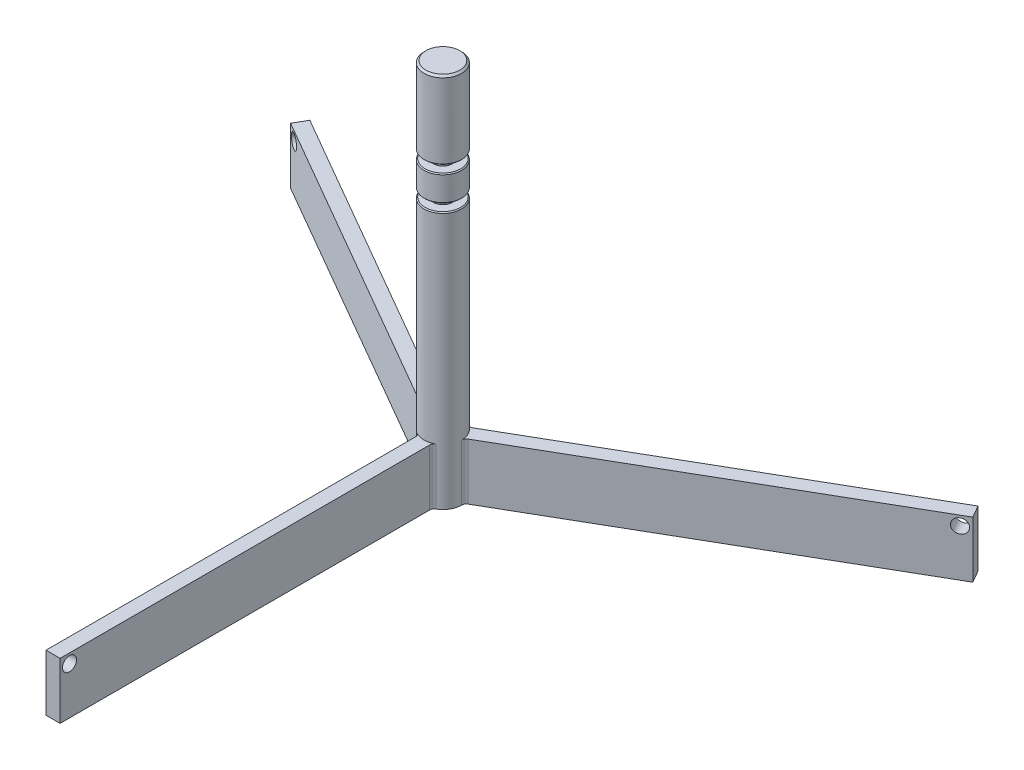
ISO-10303-21;
HEADER;
FILE_DESCRIPTION(('STEP AP214'),'2;1');
FILE_NAME('part.step','',(''),(''),'','','');
FILE_SCHEMA(('AUTOMOTIVE_DESIGN { 1 0 10303 214 1 1 1 1 }'));
ENDSEC;
DATA;
#1=APPLICATION_CONTEXT('core data for automotive mechanical design processes');
#2=APPLICATION_PROTOCOL_DEFINITION('international standard','automotive_design',2000,#1);
#3=PRODUCT_CONTEXT('',#1,'mechanical');
#4=PRODUCT('Part','Part','',(#3));
#5=PRODUCT_RELATED_PRODUCT_CATEGORY('part','',(#4));
#6=PRODUCT_DEFINITION_FORMATION('','',#4);
#7=PRODUCT_DEFINITION_CONTEXT('part definition',#1,'design');
#8=PRODUCT_DEFINITION('design','',#6,#7);
#9=PRODUCT_DEFINITION_SHAPE('','',#8);
#10=(LENGTH_UNIT() NAMED_UNIT(*) SI_UNIT(.MILLI.,.METRE.));
#11=(NAMED_UNIT(*) PLANE_ANGLE_UNIT() SI_UNIT($,.RADIAN.));
#12=(NAMED_UNIT(*) SI_UNIT($,.STERADIAN.) SOLID_ANGLE_UNIT());
#13=UNCERTAINTY_MEASURE_WITH_UNIT(LENGTH_MEASURE(1.E-05),#10,'distance_accuracy_value','');
#14=(GEOMETRIC_REPRESENTATION_CONTEXT(3) GLOBAL_UNCERTAINTY_ASSIGNED_CONTEXT((#13)) GLOBAL_UNIT_ASSIGNED_CONTEXT((#10,
#11,#12)) REPRESENTATION_CONTEXT('',''));
#15=CARTESIAN_POINT('',(0.,0.,0.));
#16=DIRECTION('',(0.,0.,1.));
#17=DIRECTION('',(1.,0.,0.));
#18=AXIS2_PLACEMENT_3D('',#15,#16,#17);
#19=CARTESIAN_POINT('',(0.,112.38552238806,0.));
#20=DIRECTION('',(0.,1.,0.));
#21=DIRECTION('',(0.,0.,1.));
#22=AXIS2_PLACEMENT_3D('',#19,#20,#21);
#23=CYLINDRICAL_SURFACE('',#22,12.7);
#24=CARTESIAN_POINT('',(0.,173.355,0.));
#25=DIRECTION('',(0.,-1.,0.));
#26=DIRECTION('',(0.,0.,-1.));
#27=AXIS2_PLACEMENT_3D('',#24,#25,#26);
#28=CIRCLE('',#27,12.7);
#29=CARTESIAN_POINT('',(0.,173.355,-12.7));
#30=VERTEX_POINT('',#29);
#31=EDGE_CURVE('E318',#30,#30,#28,.T.);
#32=ORIENTED_EDGE('',*,*,#31,.T.);
#33=EDGE_LOOP('',(#32));
#34=FACE_BOUND('',#33,.T.);
#35=CARTESIAN_POINT('',(0.,38.1,0.));
#36=DIRECTION('',(0.,-1.,0.));
#37=DIRECTION('',(0.,0.,-1.));
#38=AXIS2_PLACEMENT_3D('',#35,#36,#37);
#39=CIRCLE('',#38,12.7);
#40=CARTESIAN_POINT('',(6.35000000000009,38.1,-10.9985226280623));
#41=VERTEX_POINT('',#40);
#42=CARTESIAN_POINT('',(12.7,38.1,1.17961196366423E-13));
#43=VERTEX_POINT('',#42);
#44=EDGE_CURVE('E275',#41,#43,#39,.T.);
#45=ORIENTED_EDGE('',*,*,#44,.F.);
#46=DIRECTION('',(0.,1.,0.));
#47=VECTOR('',#46,1.);
#48=CARTESIAN_POINT('',(6.35000000000009,112.38552238806,-10.9985226280623));
#49=LINE('',#48,#47);
#50=CARTESIAN_POINT('',(6.35000000000009,0.,-10.9985226280623));
#51=VERTEX_POINT('',#50);
#52=EDGE_CURVE('E305',#41,#51,#49,.F.);
#53=ORIENTED_EDGE('',*,*,#52,.T.);
#54=CARTESIAN_POINT('',(0.,0.,0.));
#55=DIRECTION('',(0.,1.,0.));
#56=DIRECTION('',(0.,0.,1.));
#57=AXIS2_PLACEMENT_3D('',#54,#55,#56);
#58=CIRCLE('',#57,12.7);
#59=CARTESIAN_POINT('',(-6.34999999999994,0.,-10.9985226280624));
#60=VERTEX_POINT('',#59);
#61=EDGE_CURVE('E240',#51,#60,#58,.T.);
#62=ORIENTED_EDGE('',*,*,#61,.T.);
#63=DIRECTION('',(0.,1.,0.));
#64=VECTOR('',#63,1.);
#65=CARTESIAN_POINT('',(-6.34999999999994,112.38552238806,-10.9985226280624));
#66=LINE('',#65,#64);
#67=CARTESIAN_POINT('',(-6.34999999999994,38.1,-10.9985226280624));
#68=VERTEX_POINT('',#67);
#69=EDGE_CURVE('E281',#60,#68,#66,.T.);
#70=ORIENTED_EDGE('',*,*,#69,.T.);
#71=CARTESIAN_POINT('',(-12.7,38.1,0.));
#72=VERTEX_POINT('',#71);
#73=EDGE_CURVE('E277',#72,#68,#39,.T.);
#74=ORIENTED_EDGE('',*,*,#73,.F.);
#75=DIRECTION('',(0.,1.,0.));
#76=VECTOR('',#75,1.);
#77=CARTESIAN_POINT('',(-12.7,112.38552238806,0.));
#78=LINE('',#77,#76);
#79=CARTESIAN_POINT('',(-12.7,0.,0.));
#80=VERTEX_POINT('',#79);
#81=EDGE_CURVE('E284',#72,#80,#78,.F.);
#82=ORIENTED_EDGE('',*,*,#81,.T.);
#83=CARTESIAN_POINT('',(-6.35,0.,10.9985226280624));
#84=VERTEX_POINT('',#83);
#85=EDGE_CURVE('E235',#80,#84,#58,.T.);
#86=ORIENTED_EDGE('',*,*,#85,.T.);
#87=DIRECTION('',(0.,1.,0.));
#88=VECTOR('',#87,1.);
#89=CARTESIAN_POINT('',(-6.35,112.38552238806,10.9985226280624));
#90=LINE('',#89,#88);
#91=CARTESIAN_POINT('',(-6.35,38.1,10.9985226280624));
#92=VERTEX_POINT('',#91);
#93=EDGE_CURVE('E257',#84,#92,#90,.T.);
#94=ORIENTED_EDGE('',*,*,#93,.T.);
#95=CARTESIAN_POINT('',(0.,38.1,0.));
#96=DIRECTION('',(0.,-1.,0.));
#97=DIRECTION('',(0.,0.,-1.));
#98=AXIS2_PLACEMENT_3D('',#95,#96,#97);
#99=CIRCLE('',#98,12.7);
#100=CARTESIAN_POINT('',(6.35,38.1,10.9985226280624));
#101=VERTEX_POINT('',#100);
#102=EDGE_CURVE('E252',#101,#92,#99,.T.);
#103=ORIENTED_EDGE('',*,*,#102,.F.);
#104=DIRECTION('',(0.,1.,0.));
#105=VECTOR('',#104,1.);
#106=CARTESIAN_POINT('',(6.35,112.38552238806,10.9985226280624));
#107=LINE('',#106,#105);
#108=CARTESIAN_POINT('',(6.35,0.,10.9985226280624));
#109=VERTEX_POINT('',#108);
#110=EDGE_CURVE('E260',#101,#109,#107,.F.);
#111=ORIENTED_EDGE('',*,*,#110,.T.);
#112=CARTESIAN_POINT('',(12.7,0.,1.17961196366423E-13));
#113=VERTEX_POINT('',#112);
#114=EDGE_CURVE('E236',#109,#113,#58,.T.);
#115=ORIENTED_EDGE('',*,*,#114,.T.);
#116=DIRECTION('',(0.,1.,0.));
#117=VECTOR('',#116,1.);
#118=CARTESIAN_POINT('',(12.7,112.38552238806,1.17961196366423E-13));
#119=LINE('',#118,#117);
#120=EDGE_CURVE('E302',#113,#43,#119,.T.);
#121=ORIENTED_EDGE('',*,*,#120,.T.);
#122=EDGE_LOOP('',(#45,#53,#62,#70,#74,#82,#86,#94,#103,#111,#115,#121));
#123=FACE_BOUND('',#122,.T.);
#124=ADVANCED_FACE('F33',(#34,#123),#23,.T.);
#125=CARTESIAN_POINT('',(0.,254.,0.));
#126=DIRECTION('',(0.,-1.,0.));
#127=DIRECTION('',(0.,0.,-1.));
#128=AXIS2_PLACEMENT_3D('',#125,#126,#127);
#129=PLANE('',#128);
#130=CARTESIAN_POINT('',(0.,254.,0.));
#131=DIRECTION('',(0.,-1.,0.));
#132=DIRECTION('',(0.,0.,-1.));
#133=AXIS2_PLACEMENT_3D('',#130,#131,#132);
#134=CIRCLE('',#133,11.43);
#135=CARTESIAN_POINT('',(0.,254.,-11.43));
#136=VERTEX_POINT('',#135);
#137=EDGE_CURVE('E41',#136,#136,#134,.F.);
#138=ORIENTED_EDGE('',*,*,#137,.T.);
#139=EDGE_LOOP('',(#138));
#140=FACE_BOUND('',#139,.T.);
#141=ADVANCED_FACE('F341',(#140),#129,.F.);
#142=CARTESIAN_POINT('',(0.,112.38552238806,0.));
#143=DIRECTION('',(0.,1.,0.));
#144=DIRECTION('',(0.,0.,1.));
#145=AXIS2_PLACEMENT_3D('',#142,#143,#144);
#146=CYLINDRICAL_SURFACE('',#145,12.7);
#147=CARTESIAN_POINT('',(0.,252.73,0.));
#148=DIRECTION('',(0.,-1.,0.));
#149=DIRECTION('',(0.,0.,-1.));
#150=AXIS2_PLACEMENT_3D('',#147,#148,#149);
#151=CIRCLE('',#150,12.7);
#152=CARTESIAN_POINT('',(0.,252.73,-12.7));
#153=VERTEX_POINT('',#152);
#154=EDGE_CURVE('E11',#153,#153,#151,.T.);
#155=ORIENTED_EDGE('',*,*,#154,.T.);
#156=EDGE_LOOP('',(#155));
#157=FACE_BOUND('',#156,.T.);
#158=CARTESIAN_POINT('',(0.,202.311,0.));
#159=DIRECTION('',(0.,1.,0.));
#160=DIRECTION('',(0.,0.,1.));
#161=AXIS2_PLACEMENT_3D('',#158,#159,#160);
#162=CIRCLE('',#161,12.7);
#163=CARTESIAN_POINT('',(0.,202.311,12.7));
#164=VERTEX_POINT('',#163);
#165=EDGE_CURVE('E333',#164,#164,#162,.T.);
#166=ORIENTED_EDGE('',*,*,#165,.T.);
#167=EDGE_LOOP('',(#166));
#168=FACE_BOUND('',#167,.T.);
#169=ADVANCED_FACE('F358',(#157,#168),#146,.T.);
#170=CARTESIAN_POINT('',(6.35,201.676,0.));
#171=DIRECTION('',(0.,1.,0.));
#172=DIRECTION('',(0.,0.,1.));
#173=AXIS2_PLACEMENT_3D('',#170,#171,#172);
#174=PLANE('',#173);
#175=CARTESIAN_POINT('',(0.,201.676,0.));
#176=DIRECTION('',(0.,1.,0.));
#177=DIRECTION('',(0.,0.,1.));
#178=AXIS2_PLACEMENT_3D('',#175,#176,#177);
#179=CIRCLE('',#178,12.065);
#180=CARTESIAN_POINT('',(0.,201.676,12.065));
#181=VERTEX_POINT('',#180);
#182=EDGE_CURVE('E336',#181,#181,#179,.F.);
#183=ORIENTED_EDGE('',*,*,#182,.T.);
#184=EDGE_LOOP('',(#183));
#185=FACE_BOUND('',#184,.T.);
#186=CARTESIAN_POINT('',(0.,201.676,0.));
#187=DIRECTION('',(0.,1.,0.));
#188=DIRECTION('',(0.,0.,1.));
#189=AXIS2_PLACEMENT_3D('',#186,#187,#188);
#190=CIRCLE('',#189,6.35);
#191=CARTESIAN_POINT('',(0.,201.676,6.35));
#192=VERTEX_POINT('',#191);
#193=EDGE_CURVE('E249',#192,#192,#190,.T.);
#194=ORIENTED_EDGE('',*,*,#193,.T.);
#195=EDGE_LOOP('',(#194));
#196=FACE_BOUND('',#195,.T.);
#197=ADVANCED_FACE('F387',(#185,#196),#174,.F.);
#198=CARTESIAN_POINT('',(0.,112.38552238806,0.));
#199=DIRECTION('',(0.,1.,0.));
#200=DIRECTION('',(0.,0.,1.));
#201=AXIS2_PLACEMENT_3D('',#198,#199,#200);
#202=CYLINDRICAL_SURFACE('',#201,6.35);
#203=ORIENTED_EDGE('',*,*,#193,.F.);
#204=EDGE_LOOP('',(#203));
#205=FACE_BOUND('',#204,.T.);
#206=CARTESIAN_POINT('',(0.,196.596,0.));
#207=DIRECTION('',(0.,1.,0.));
#208=DIRECTION('',(0.,0.,1.));
#209=AXIS2_PLACEMENT_3D('',#206,#207,#208);
#210=CIRCLE('',#209,6.35);
#211=CARTESIAN_POINT('',(0.,196.596,6.35));
#212=VERTEX_POINT('',#211);
#213=EDGE_CURVE('E246',#212,#212,#210,.T.);
#214=ORIENTED_EDGE('',*,*,#213,.T.);
#215=EDGE_LOOP('',(#214));
#216=FACE_BOUND('',#215,.T.);
#217=ADVANCED_FACE('F383',(#205,#216),#202,.T.);
#218=CARTESIAN_POINT('',(12.7,196.596,0.));
#219=DIRECTION('',(0.,-1.,0.));
#220=DIRECTION('',(0.,0.,-1.));
#221=AXIS2_PLACEMENT_3D('',#218,#219,#220);
#222=PLANE('',#221);
#223=CARTESIAN_POINT('',(0.,196.596,0.));
#224=DIRECTION('',(0.,-1.,0.));
#225=DIRECTION('',(0.,0.,-1.));
#226=AXIS2_PLACEMENT_3D('',#223,#224,#225);
#227=CIRCLE('',#226,12.065);
#228=CARTESIAN_POINT('',(0.,196.596,-12.065));
#229=VERTEX_POINT('',#228);
#230=EDGE_CURVE('E330',#229,#229,#227,.F.);
#231=ORIENTED_EDGE('',*,*,#230,.T.);
#232=EDGE_LOOP('',(#231));
#233=FACE_BOUND('',#232,.T.);
#234=ORIENTED_EDGE('',*,*,#213,.F.);
#235=EDGE_LOOP('',(#234));
#236=FACE_BOUND('',#235,.T.);
#237=ADVANCED_FACE('F379',(#233,#236),#222,.F.);
#238=CARTESIAN_POINT('',(0.,112.38552238806,0.));
#239=DIRECTION('',(0.,1.,0.));
#240=DIRECTION('',(0.,0.,1.));
#241=AXIS2_PLACEMENT_3D('',#238,#239,#240);
#242=CYLINDRICAL_SURFACE('',#241,12.7);
#243=CARTESIAN_POINT('',(0.,179.705,0.));
#244=DIRECTION('',(0.,1.,0.));
#245=DIRECTION('',(0.,0.,1.));
#246=AXIS2_PLACEMENT_3D('',#243,#244,#245);
#247=CIRCLE('',#246,12.7);
#248=CARTESIAN_POINT('',(0.,179.705,12.7));
#249=VERTEX_POINT('',#248);
#250=EDGE_CURVE('E324',#249,#249,#247,.T.);
#251=ORIENTED_EDGE('',*,*,#250,.T.);
#252=EDGE_LOOP('',(#251));
#253=FACE_BOUND('',#252,.T.);
#254=CARTESIAN_POINT('',(0.,195.961,0.));
#255=DIRECTION('',(0.,-1.,0.));
#256=DIRECTION('',(0.,0.,-1.));
#257=AXIS2_PLACEMENT_3D('',#254,#255,#256);
#258=CIRCLE('',#257,12.7);
#259=CARTESIAN_POINT('',(0.,195.961,-12.7));
#260=VERTEX_POINT('',#259);
#261=EDGE_CURVE('E321',#260,#260,#258,.T.);
#262=ORIENTED_EDGE('',*,*,#261,.T.);
#263=EDGE_LOOP('',(#262));
#264=FACE_BOUND('',#263,.T.);
#265=ADVANCED_FACE('F375',(#253,#264),#242,.T.);
#266=CARTESIAN_POINT('',(6.35,179.07,0.));
#267=DIRECTION('',(0.,1.,0.));
#268=DIRECTION('',(0.,0.,1.));
#269=AXIS2_PLACEMENT_3D('',#266,#267,#268);
#270=PLANE('',#269);
#271=CARTESIAN_POINT('',(0.,179.07,0.));
#272=DIRECTION('',(0.,1.,0.));
#273=DIRECTION('',(0.,0.,1.));
#274=AXIS2_PLACEMENT_3D('',#271,#272,#273);
#275=CIRCLE('',#274,12.065);
#276=CARTESIAN_POINT('',(0.,179.07,12.065));
#277=VERTEX_POINT('',#276);
#278=EDGE_CURVE('E327',#277,#277,#275,.F.);
#279=ORIENTED_EDGE('',*,*,#278,.T.);
#280=EDGE_LOOP('',(#279));
#281=FACE_BOUND('',#280,.T.);
#282=CARTESIAN_POINT('',(0.,179.07,0.));
#283=DIRECTION('',(0.,1.,0.));
#284=DIRECTION('',(0.,0.,1.));
#285=AXIS2_PLACEMENT_3D('',#282,#283,#284);
#286=CIRCLE('',#285,6.35);
#287=CARTESIAN_POINT('',(0.,179.07,6.35));
#288=VERTEX_POINT('',#287);
#289=EDGE_CURVE('E243',#288,#288,#286,.T.);
#290=ORIENTED_EDGE('',*,*,#289,.T.);
#291=EDGE_LOOP('',(#290));
#292=FACE_BOUND('',#291,.T.);
#293=ADVANCED_FACE('F371',(#281,#292),#270,.F.);
#294=CARTESIAN_POINT('',(0.,112.38552238806,0.));
#295=DIRECTION('',(0.,1.,0.));
#296=DIRECTION('',(0.,0.,1.));
#297=AXIS2_PLACEMENT_3D('',#294,#295,#296);
#298=CYLINDRICAL_SURFACE('',#297,6.35);
#299=ORIENTED_EDGE('',*,*,#289,.F.);
#300=EDGE_LOOP('',(#299));
#301=FACE_BOUND('',#300,.T.);
#302=CARTESIAN_POINT('',(0.,173.99,0.));
#303=DIRECTION('',(0.,1.,0.));
#304=DIRECTION('',(0.,0.,1.));
#305=AXIS2_PLACEMENT_3D('',#302,#303,#304);
#306=CIRCLE('',#305,6.35);
#307=CARTESIAN_POINT('',(0.,173.99,6.35));
#308=VERTEX_POINT('',#307);
#309=EDGE_CURVE('E239',#308,#308,#306,.T.);
#310=ORIENTED_EDGE('',*,*,#309,.T.);
#311=EDGE_LOOP('',(#310));
#312=FACE_BOUND('',#311,.T.);
#313=ADVANCED_FACE('F367',(#301,#312),#298,.T.);
#314=CARTESIAN_POINT('',(12.7,173.99,0.));
#315=DIRECTION('',(0.,-1.,0.));
#316=DIRECTION('',(0.,0.,-1.));
#317=AXIS2_PLACEMENT_3D('',#314,#315,#316);
#318=PLANE('',#317);
#319=CARTESIAN_POINT('',(0.,173.99,0.));
#320=DIRECTION('',(0.,-1.,0.));
#321=DIRECTION('',(0.,0.,-1.));
#322=AXIS2_PLACEMENT_3D('',#319,#320,#321);
#323=CIRCLE('',#322,12.065);
#324=CARTESIAN_POINT('',(0.,173.99,-12.065));
#325=VERTEX_POINT('',#324);
#326=EDGE_CURVE('E315',#325,#325,#323,.F.);
#327=ORIENTED_EDGE('',*,*,#326,.T.);
#328=EDGE_LOOP('',(#327));
#329=FACE_BOUND('',#328,.T.);
#330=ORIENTED_EDGE('',*,*,#309,.F.);
#331=EDGE_LOOP('',(#330));
#332=FACE_BOUND('',#331,.T.);
#333=ADVANCED_FACE('F364',(#329,#332),#318,.F.);
#334=CARTESIAN_POINT('',(0.,0.,0.));
#335=DIRECTION('',(0.,1.,0.));
#336=DIRECTION('',(0.,0.,1.));
#337=AXIS2_PLACEMENT_3D('',#334,#335,#336);
#338=PLANE('',#337);
#339=ORIENTED_EDGE('',*,*,#85,.F.);
#340=CARTESIAN_POINT('',(-15.875,0.,0.));
#341=DIRECTION('',(0.,1.,0.));
#342=DIRECTION('',(0.,0.,1.));
#343=AXIS2_PLACEMENT_3D('',#340,#341,#342);
#344=CIRCLE('',#343,3.175);
#345=CARTESIAN_POINT('',(-14.2875,0.,-2.74963065701563));
#346=VERTEX_POINT('',#345);
#347=EDGE_CURVE('E292',#80,#346,#344,.T.);
#348=ORIENTED_EDGE('',*,*,#347,.T.);
#349=DIRECTION('',(0.866025403784436,0.,0.500000000000004));
#350=VECTOR('',#349,1.);
#351=CARTESIAN_POINT('',(-230.600594532294,0.,-127.638054014478));
#352=LINE('',#351,#350);
#353=CARTESIAN_POINT('',(-230.600594532294,0.,-127.638054014478));
#354=VERTEX_POINT('',#353);
#355=EDGE_CURVE('E202',#354,#346,#352,.T.);
#356=ORIENTED_EDGE('',*,*,#355,.F.);
#357=DIRECTION('',(-0.500000000000004,0.,0.866025403784436));
#358=VECTOR('',#357,1.);
#359=CARTESIAN_POINT('',(-225.838094532294,0.,-135.886945985524));
#360=LINE('',#359,#358);
#361=CARTESIAN_POINT('',(-225.838094532294,0.,-135.886945985524));
#362=VERTEX_POINT('',#361);
#363=EDGE_CURVE('E185',#362,#354,#360,.T.);
#364=ORIENTED_EDGE('',*,*,#363,.F.);
#365=DIRECTION('',(0.866025403784436,0.,0.500000000000004));
#366=VECTOR('',#365,1.);
#367=CARTESIAN_POINT('',(-225.838094532294,0.,-135.886945985524));
#368=LINE('',#367,#366);
#369=CARTESIAN_POINT('',(-9.5249999999999,0.,-10.9985226280624));
#370=VERTEX_POINT('',#369);
#371=EDGE_CURVE('E205',#362,#370,#368,.T.);
#372=ORIENTED_EDGE('',*,*,#371,.T.);
#373=CARTESIAN_POINT('',(-7.93749999999992,0.,-13.748153285078));
#374=DIRECTION('',(0.,1.,0.));
#375=DIRECTION('',(0.,0.,1.));
#376=AXIS2_PLACEMENT_3D('',#373,#374,#375);
#377=CIRCLE('',#376,3.175);
#378=EDGE_CURVE('E294',#370,#60,#377,.T.);
#379=ORIENTED_EDGE('',*,*,#378,.T.);
#380=ORIENTED_EDGE('',*,*,#61,.F.);
#381=CARTESIAN_POINT('',(7.93750000000011,0.,-13.7481532850779));
#382=DIRECTION('',(0.,1.,0.));
#383=DIRECTION('',(0.,0.,1.));
#384=AXIS2_PLACEMENT_3D('',#381,#382,#383);
#385=CIRCLE('',#384,3.175);
#386=CARTESIAN_POINT('',(9.52500000000009,0.,-10.9985226280623));
#387=VERTEX_POINT('',#386);
#388=EDGE_CURVE('E311',#51,#387,#385,.T.);
#389=ORIENTED_EDGE('',*,*,#388,.T.);
#390=DIRECTION('',(-0.866025403784443,0.,0.499999999999992));
#391=VECTOR('',#390,1.);
#392=CARTESIAN_POINT('',(225.838094532295,0.,-135.886945985521));
#393=LINE('',#392,#391);
#394=CARTESIAN_POINT('',(225.838094532295,0.,-135.886945985521));
#395=VERTEX_POINT('',#394);
#396=EDGE_CURVE('E167',#395,#387,#393,.T.);
#397=ORIENTED_EDGE('',*,*,#396,.F.);
#398=DIRECTION('',(-0.499999999999992,0.,-0.866025403784443));
#399=VECTOR('',#398,1.);
#400=CARTESIAN_POINT('',(230.600594532295,0.,-127.638054014474));
#401=LINE('',#400,#399);
#402=CARTESIAN_POINT('',(230.600594532295,0.,-127.638054014474));
#403=VERTEX_POINT('',#402);
#404=EDGE_CURVE('E160',#403,#395,#401,.T.);
#405=ORIENTED_EDGE('',*,*,#404,.F.);
#406=DIRECTION('',(-0.866025403784443,0.,0.499999999999992));
#407=VECTOR('',#406,1.);
#408=CARTESIAN_POINT('',(230.600594532295,0.,-127.638054014474));
#409=LINE('',#408,#407);
#410=CARTESIAN_POINT('',(14.2875,0.,-2.74963065701544));
#411=VERTEX_POINT('',#410);
#412=EDGE_CURVE('E165',#403,#411,#409,.T.);
#413=ORIENTED_EDGE('',*,*,#412,.T.);
#414=CARTESIAN_POINT('',(15.875,0.,1.47451495458029E-13));
#415=DIRECTION('',(0.,1.,0.));
#416=DIRECTION('',(0.,0.,1.));
#417=AXIS2_PLACEMENT_3D('',#414,#415,#416);
#418=CIRCLE('',#417,3.175);
#419=EDGE_CURVE('E48',#411,#113,#418,.T.);
#420=ORIENTED_EDGE('',*,*,#419,.T.);
#421=ORIENTED_EDGE('',*,*,#114,.F.);
#422=CARTESIAN_POINT('',(7.9375,0.,13.748153285078));
#423=DIRECTION('',(0.,1.,0.));
#424=DIRECTION('',(0.,0.,1.));
#425=AXIS2_PLACEMENT_3D('',#422,#423,#424);
#426=CIRCLE('',#425,3.175);
#427=CARTESIAN_POINT('',(4.7625,0.,13.748153285078));
#428=VERTEX_POINT('',#427);
#429=EDGE_CURVE('E268',#109,#428,#426,.T.);
#430=ORIENTED_EDGE('',*,*,#429,.T.);
#431=DIRECTION('',(0.,0.,-1.));
#432=VECTOR('',#431,1.);
#433=CARTESIAN_POINT('',(4.7625,0.,263.525));
#434=LINE('',#433,#432);
#435=CARTESIAN_POINT('',(4.7625,0.,263.525));
#436=VERTEX_POINT('',#435);
#437=EDGE_CURVE('E229',#436,#428,#434,.T.);
#438=ORIENTED_EDGE('',*,*,#437,.F.);
#439=DIRECTION('',(1.,0.,0.));
#440=VECTOR('',#439,1.);
#441=CARTESIAN_POINT('',(-4.7625,0.,263.525));
#442=LINE('',#441,#440);
#443=CARTESIAN_POINT('',(-4.7625,0.,263.525));
#444=VERTEX_POINT('',#443);
#445=EDGE_CURVE('E217',#444,#436,#442,.T.);
#446=ORIENTED_EDGE('',*,*,#445,.F.);
#447=DIRECTION('',(0.,0.,-1.));
#448=VECTOR('',#447,1.);
#449=CARTESIAN_POINT('',(-4.7625,0.,263.525));
#450=LINE('',#449,#448);
#451=CARTESIAN_POINT('',(-4.7625,0.,13.748153285078));
#452=VERTEX_POINT('',#451);
#453=EDGE_CURVE('E232',#444,#452,#450,.T.);
#454=ORIENTED_EDGE('',*,*,#453,.T.);
#455=CARTESIAN_POINT('',(-7.9375,0.,13.748153285078));
#456=DIRECTION('',(0.,1.,0.));
#457=DIRECTION('',(0.,0.,1.));
#458=AXIS2_PLACEMENT_3D('',#455,#456,#457);
#459=CIRCLE('',#458,3.175);
#460=EDGE_CURVE('E270',#452,#84,#459,.T.);
#461=ORIENTED_EDGE('',*,*,#460,.T.);
#462=EDGE_LOOP('',(#339,#348,#356,#364,#372,#379,#380,#389,#397,#405,#413,#420,#421,#430,#438,
#446,#454,#461));
#463=FACE_BOUND('',#462,.T.);
#464=ADVANCED_FACE('F163',(#463),#338,.F.);
#465=CARTESIAN_POINT('',(-4.7625,0.,263.525));
#466=DIRECTION('',(1.,0.,0.));
#467=DIRECTION('',(0.,1.,0.));
#468=AXIS2_PLACEMENT_3D('',#465,#466,#467);
#469=PLANE('',#468);
#470=CARTESIAN_POINT('',(-4.7625,31.75,257.175));
#471=DIRECTION('',(1.,0.,0.));
#472=DIRECTION('',(0.,1.,0.));
#473=AXIS2_PLACEMENT_3D('',#470,#471,#472);
#474=CIRCLE('',#473,4.76250000000001);
#475=CARTESIAN_POINT('',(-4.7625,36.5125,257.175));
#476=VERTEX_POINT('',#475);
#477=EDGE_CURVE('E211',#476,#476,#474,.T.);
#478=ORIENTED_EDGE('',*,*,#477,.T.);
#479=EDGE_LOOP('',(#478));
#480=FACE_BOUND('',#479,.T.);
#481=DIRECTION('',(0.,0.,-1.));
#482=VECTOR('',#481,1.);
#483=CARTESIAN_POINT('',(-4.7625,38.1,263.525));
#484=LINE('',#483,#482);
#485=CARTESIAN_POINT('',(-4.7625,38.1,263.525));
#486=VERTEX_POINT('',#485);
#487=CARTESIAN_POINT('',(-4.7625,38.1,13.748153285078));
#488=VERTEX_POINT('',#487);
#489=EDGE_CURVE('E223',#486,#488,#484,.T.);
#490=ORIENTED_EDGE('',*,*,#489,.T.);
#491=DIRECTION('',(0.,-1.,0.));
#492=VECTOR('',#491,1.);
#493=CARTESIAN_POINT('',(-4.7625,0.,13.748153285078));
#494=LINE('',#493,#492);
#495=EDGE_CURVE('E262',#488,#452,#494,.T.);
#496=ORIENTED_EDGE('',*,*,#495,.T.);
#497=ORIENTED_EDGE('',*,*,#453,.F.);
#498=DIRECTION('',(0.,-1.,0.));
#499=VECTOR('',#498,1.);
#500=CARTESIAN_POINT('',(-4.7625,0.,263.525));
#501=LINE('',#500,#499);
#502=EDGE_CURVE('E214',#486,#444,#501,.T.);
#503=ORIENTED_EDGE('',*,*,#502,.F.);
#504=EDGE_LOOP('',(#490,#496,#497,#503));
#505=FACE_BOUND('',#504,.T.);
#506=ADVANCED_FACE('F499',(#480,#505),#469,.F.);
#507=CARTESIAN_POINT('',(4.7625,0.,263.525));
#508=DIRECTION('',(-1.,0.,0.));
#509=DIRECTION('',(0.,-1.,0.));
#510=AXIS2_PLACEMENT_3D('',#507,#508,#509);
#511=PLANE('',#510);
#512=CARTESIAN_POINT('',(4.7625,31.75,257.175));
#513=DIRECTION('',(1.,0.,0.));
#514=DIRECTION('',(0.,1.,0.));
#515=AXIS2_PLACEMENT_3D('',#512,#513,#514);
#516=CIRCLE('',#515,4.76250000000001);
#517=CARTESIAN_POINT('',(4.7625,36.5125,257.175));
#518=VERTEX_POINT('',#517);
#519=EDGE_CURVE('E208',#518,#518,#516,.T.);
#520=ORIENTED_EDGE('',*,*,#519,.F.);
#521=EDGE_LOOP('',(#520));
#522=FACE_BOUND('',#521,.T.);
#523=ORIENTED_EDGE('',*,*,#437,.T.);
#524=DIRECTION('',(0.,-1.,0.));
#525=VECTOR('',#524,1.);
#526=CARTESIAN_POINT('',(4.7625,38.1,13.748153285078));
#527=LINE('',#526,#525);
#528=CARTESIAN_POINT('',(4.7625,38.1,13.748153285078));
#529=VERTEX_POINT('',#528);
#530=EDGE_CURVE('E254',#428,#529,#527,.F.);
#531=ORIENTED_EDGE('',*,*,#530,.T.);
#532=DIRECTION('',(0.,0.,-1.));
#533=VECTOR('',#532,1.);
#534=CARTESIAN_POINT('',(4.7625,38.1,263.525));
#535=LINE('',#534,#533);
#536=CARTESIAN_POINT('',(4.7625,38.1,263.525));
#537=VERTEX_POINT('',#536);
#538=EDGE_CURVE('E226',#537,#529,#535,.T.);
#539=ORIENTED_EDGE('',*,*,#538,.F.);
#540=DIRECTION('',(0.,1.,0.));
#541=VECTOR('',#540,1.);
#542=CARTESIAN_POINT('',(4.7625,0.,263.525));
#543=LINE('',#542,#541);
#544=EDGE_CURVE('E219',#436,#537,#543,.T.);
#545=ORIENTED_EDGE('',*,*,#544,.F.);
#546=EDGE_LOOP('',(#523,#531,#539,#545));
#547=FACE_BOUND('',#546,.T.);
#548=ADVANCED_FACE('F507',(#522,#547),#511,.F.);
#549=CARTESIAN_POINT('',(-4.7625,38.1,263.525));
#550=DIRECTION('',(0.,-1.,0.));
#551=DIRECTION('',(0.,0.,-1.));
#552=AXIS2_PLACEMENT_3D('',#549,#550,#551);
#553=PLANE('',#552);
#554=ORIENTED_EDGE('',*,*,#538,.T.);
#555=CARTESIAN_POINT('',(7.9375,38.1,13.748153285078));
#556=DIRECTION('',(0.,-1.,0.));
#557=DIRECTION('',(0.,0.,-1.));
#558=AXIS2_PLACEMENT_3D('',#555,#556,#557);
#559=CIRCLE('',#558,3.175);
#560=EDGE_CURVE('E265',#529,#101,#559,.T.);
#561=ORIENTED_EDGE('',*,*,#560,.T.);
#562=ORIENTED_EDGE('',*,*,#102,.T.);
#563=CARTESIAN_POINT('',(-7.9375,38.1,13.748153285078));
#564=DIRECTION('',(0.,-1.,0.));
#565=DIRECTION('',(0.,0.,-1.));
#566=AXIS2_PLACEMENT_3D('',#563,#564,#565);
#567=CIRCLE('',#566,3.175);
#568=EDGE_CURVE('E273',#92,#488,#567,.T.);
#569=ORIENTED_EDGE('',*,*,#568,.T.);
#570=ORIENTED_EDGE('',*,*,#489,.F.);
#571=DIRECTION('',(-1.,0.,0.));
#572=VECTOR('',#571,1.);
#573=CARTESIAN_POINT('',(-4.7625,38.1,263.525));
#574=LINE('',#573,#572);
#575=EDGE_CURVE('E221',#537,#486,#574,.T.);
#576=ORIENTED_EDGE('',*,*,#575,.F.);
#577=EDGE_LOOP('',(#554,#561,#562,#569,#570,#576));
#578=FACE_BOUND('',#577,.T.);
#579=ADVANCED_FACE('F515',(#578),#553,.F.);
#580=CARTESIAN_POINT('',(-4.7625,38.1,263.525));
#581=DIRECTION('',(0.,0.,-1.));
#582=DIRECTION('',(-1.,0.,0.));
#583=AXIS2_PLACEMENT_3D('',#580,#581,#582);
#584=PLANE('',#583);
#585=ORIENTED_EDGE('',*,*,#502,.T.);
#586=ORIENTED_EDGE('',*,*,#445,.T.);
#587=ORIENTED_EDGE('',*,*,#544,.T.);
#588=ORIENTED_EDGE('',*,*,#575,.T.);
#589=EDGE_LOOP('',(#585,#586,#587,#588));
#590=FACE_BOUND('',#589,.T.);
#591=ADVANCED_FACE('F523',(#590),#584,.F.);
#592=CARTESIAN_POINT('',(-12.7,31.75,257.175));
#593=DIRECTION('',(1.,0.,0.));
#594=DIRECTION('',(0.,1.,0.));
#595=AXIS2_PLACEMENT_3D('',#592,#593,#594);
#596=CYLINDRICAL_SURFACE('',#595,4.76250000000001);
#597=ORIENTED_EDGE('',*,*,#519,.T.);
#598=EDGE_LOOP('',(#597));
#599=FACE_BOUND('',#598,.T.);
#600=ORIENTED_EDGE('',*,*,#477,.F.);
#601=EDGE_LOOP('',(#600));
#602=FACE_BOUND('',#601,.T.);
#603=ADVANCED_FACE('F399',(#599,#602),#596,.F.);
#604=CARTESIAN_POINT('',(7.9375,112.38552238806,13.748153285078));
#605=DIRECTION('',(0.,1.,0.));
#606=DIRECTION('',(0.,0.,1.));
#607=AXIS2_PLACEMENT_3D('',#604,#605,#606);
#608=CYLINDRICAL_SURFACE('',#607,3.175);
#609=ORIENTED_EDGE('',*,*,#429,.F.);
#610=ORIENTED_EDGE('',*,*,#110,.F.);
#611=ORIENTED_EDGE('',*,*,#560,.F.);
#612=ORIENTED_EDGE('',*,*,#530,.F.);
#613=EDGE_LOOP('',(#609,#610,#611,#612));
#614=FACE_BOUND('',#613,.T.);
#615=ADVANCED_FACE('F395',(#614),#608,.F.);
#616=CARTESIAN_POINT('',(-7.9375,112.38552238806,13.748153285078));
#617=DIRECTION('',(0.,1.,0.));
#618=DIRECTION('',(0.,0.,1.));
#619=AXIS2_PLACEMENT_3D('',#616,#617,#618);
#620=CYLINDRICAL_SURFACE('',#619,3.175);
#621=ORIENTED_EDGE('',*,*,#568,.F.);
#622=ORIENTED_EDGE('',*,*,#93,.F.);
#623=ORIENTED_EDGE('',*,*,#460,.F.);
#624=ORIENTED_EDGE('',*,*,#495,.F.);
#625=EDGE_LOOP('',(#621,#622,#623,#624));
#626=FACE_BOUND('',#625,.T.);
#627=ADVANCED_FACE('F398',(#626),#620,.F.);
#628=CARTESIAN_POINT('',(230.600594532295,38.1,-127.638054014474));
#629=DIRECTION('',(-0.866025403784443,0.,0.499999999999992));
#630=DIRECTION('',(0.499999999999992,0.,0.866025403784443));
#631=AXIS2_PLACEMENT_3D('',#628,#629,#630);
#632=PLANE('',#631);
#633=DIRECTION('',(0.,-1.,0.));
#634=VECTOR('',#633,1.);
#635=CARTESIAN_POINT('',(230.600594532295,0.,-127.638054014474));
#636=LINE('',#635,#634);
#637=CARTESIAN_POINT('',(230.600594532295,38.1,-127.638054014474));
#638=VERTEX_POINT('',#637);
#639=EDGE_CURVE('E171',#638,#403,#636,.T.);
#640=ORIENTED_EDGE('',*,*,#639,.T.);
#641=ORIENTED_EDGE('',*,*,#404,.T.);
#642=DIRECTION('',(0.,1.,0.));
#643=VECTOR('',#642,1.);
#644=CARTESIAN_POINT('',(225.838094532295,0.,-135.886945985521));
#645=LINE('',#644,#643);
#646=CARTESIAN_POINT('',(225.838094532295,38.1,-135.886945985521));
#647=VERTEX_POINT('',#646);
#648=EDGE_CURVE('E170',#395,#647,#645,.T.);
#649=ORIENTED_EDGE('',*,*,#648,.T.);
#650=DIRECTION('',(0.499999999999992,0.,0.866025403784443));
#651=VECTOR('',#650,1.);
#652=CARTESIAN_POINT('',(230.600594532295,38.1,-127.638054014474));
#653=LINE('',#652,#651);
#654=EDGE_CURVE('E176',#647,#638,#653,.T.);
#655=ORIENTED_EDGE('',*,*,#654,.T.);
#656=EDGE_LOOP('',(#640,#641,#649,#655));
#657=FACE_BOUND('',#656,.T.);
#658=ADVANCED_FACE('F174',(#657),#632,.F.);
#659=CARTESIAN_POINT('',(230.600594532295,0.,-127.638054014474));
#660=DIRECTION('',(-0.499999999999992,0.,-0.866025403784443));
#661=DIRECTION('',(-0.866025403784443,0.,0.499999999999992));
#662=AXIS2_PLACEMENT_3D('',#659,#660,#661);
#663=PLANE('',#662);
#664=CARTESIAN_POINT('',(225.101333218264,31.75,-124.463054014475));
#665=DIRECTION('',(-0.499999999999992,0.,-0.866025403784443));
#666=DIRECTION('',(-0.866025403784443,0.,0.499999999999992));
#667=AXIS2_PLACEMENT_3D('',#664,#665,#666);
#668=CIRCLE('',#667,4.76250000000001);
#669=CARTESIAN_POINT('',(220.976887232741,31.75,-122.081804014475));
#670=VERTEX_POINT('',#669);
#671=EDGE_CURVE('E729',#670,#670,#668,.T.);
#672=ORIENTED_EDGE('',*,*,#671,.T.);
#673=EDGE_LOOP('',(#672));
#674=FACE_BOUND('',#673,.T.);
#675=DIRECTION('',(-0.866025403784443,0.,0.499999999999992));
#676=VECTOR('',#675,1.);
#677=CARTESIAN_POINT('',(230.600594532295,38.1,-127.638054014474));
#678=LINE('',#677,#676);
#679=CARTESIAN_POINT('',(14.2875,38.1,-2.74963065701544));
#680=VERTEX_POINT('',#679);
#681=EDGE_CURVE('E740',#638,#680,#678,.T.);
#682=ORIENTED_EDGE('',*,*,#681,.T.);
#683=DIRECTION('',(0.,-1.,0.));
#684=VECTOR('',#683,1.);
#685=CARTESIAN_POINT('',(14.2875,0.,-2.74963065701547));
#686=LINE('',#685,#684);
#687=EDGE_CURVE('E181',#680,#411,#686,.T.);
#688=ORIENTED_EDGE('',*,*,#687,.T.);
#689=ORIENTED_EDGE('',*,*,#412,.F.);
#690=ORIENTED_EDGE('',*,*,#639,.F.);
#691=EDGE_LOOP('',(#682,#688,#689,#690));
#692=FACE_BOUND('',#691,.T.);
#693=ADVANCED_FACE('F180',(#674,#692),#663,.F.);
#694=CARTESIAN_POINT('',(225.838094532295,0.,-135.886945985521));
#695=DIRECTION('',(0.499999999999992,0.,0.866025403784443));
#696=DIRECTION('',(0.866025403784443,0.,-0.499999999999992));
#697=AXIS2_PLACEMENT_3D('',#694,#695,#696);
#698=PLANE('',#697);
#699=CARTESIAN_POINT('',(220.338833218264,31.75,-132.711945985521));
#700=DIRECTION('',(-0.499999999999992,0.,-0.866025403784443));
#701=DIRECTION('',(0.,1.,0.));
#702=AXIS2_PLACEMENT_3D('',#699,#700,#701);
#703=CIRCLE('',#702,4.76250000000001);
#704=CARTESIAN_POINT('',(220.338833218264,36.5125,-132.711945985521));
#705=VERTEX_POINT('',#704);
#706=EDGE_CURVE('E726',#705,#705,#703,.T.);
#707=ORIENTED_EDGE('',*,*,#706,.F.);
#708=EDGE_LOOP('',(#707));
#709=FACE_BOUND('',#708,.T.);
#710=ORIENTED_EDGE('',*,*,#396,.T.);
#711=DIRECTION('',(0.,-1.,0.));
#712=VECTOR('',#711,1.);
#713=CARTESIAN_POINT('',(9.52500000000009,38.1,-10.9985226280623));
#714=LINE('',#713,#712);
#715=CARTESIAN_POINT('',(9.52500000000009,38.1,-10.9985226280623));
#716=VERTEX_POINT('',#715);
#717=EDGE_CURVE('E299',#387,#716,#714,.F.);
#718=ORIENTED_EDGE('',*,*,#717,.T.);
#719=DIRECTION('',(-0.866025403784443,0.,0.499999999999992));
#720=VECTOR('',#719,1.);
#721=CARTESIAN_POINT('',(225.838094532295,38.1,-135.886945985521));
#722=LINE('',#721,#720);
#723=EDGE_CURVE('E187',#647,#716,#722,.T.);
#724=ORIENTED_EDGE('',*,*,#723,.F.);
#725=ORIENTED_EDGE('',*,*,#648,.F.);
#726=EDGE_LOOP('',(#710,#718,#724,#725));
#727=FACE_BOUND('',#726,.T.);
#728=ADVANCED_FACE('F555',(#709,#727),#698,.F.);
#729=CARTESIAN_POINT('',(-225.838094532294,38.1,-135.886945985524));
#730=DIRECTION('',(0.,-1.,0.));
#731=DIRECTION('',(0.,0.,-1.));
#732=AXIS2_PLACEMENT_3D('',#729,#730,#731);
#733=PLANE('',#732);
#734=ORIENTED_EDGE('',*,*,#723,.T.);
#735=CARTESIAN_POINT('',(7.93750000000011,38.1,-13.7481532850779));
#736=DIRECTION('',(0.,-1.,0.));
#737=DIRECTION('',(0.,0.,-1.));
#738=AXIS2_PLACEMENT_3D('',#735,#736,#737);
#739=CIRCLE('',#738,3.175);
#740=EDGE_CURVE('E308',#716,#41,#739,.T.);
#741=ORIENTED_EDGE('',*,*,#740,.T.);
#742=ORIENTED_EDGE('',*,*,#44,.T.);
#743=CARTESIAN_POINT('',(15.875,38.1,1.47451495458029E-13));
#744=DIRECTION('',(0.,-1.,0.));
#745=DIRECTION('',(0.,0.,-1.));
#746=AXIS2_PLACEMENT_3D('',#743,#744,#745);
#747=CIRCLE('',#746,3.175);
#748=EDGE_CURVE('E56',#43,#680,#747,.T.);
#749=ORIENTED_EDGE('',*,*,#748,.T.);
#750=ORIENTED_EDGE('',*,*,#681,.F.);
#751=ORIENTED_EDGE('',*,*,#654,.F.);
#752=EDGE_LOOP('',(#734,#741,#742,#749,#750,#751));
#753=FACE_BOUND('',#752,.T.);
#754=ADVANCED_FACE('F563',(#753),#733,.F.);
#755=CARTESIAN_POINT('',(-225.838094532294,0.,-135.886945985524));
#756=DIRECTION('',(-0.500000000000004,0.,0.866025403784436));
#757=DIRECTION('',(0.866025403784436,0.,0.500000000000004));
#758=AXIS2_PLACEMENT_3D('',#755,#756,#757);
#759=PLANE('',#758);
#760=CARTESIAN_POINT('',(-220.338833218262,31.75,-132.711945985524));
#761=DIRECTION('',(-0.500000000000004,0.,0.866025403784436));
#762=DIRECTION('',(0.866025403784436,0.,0.500000000000004));
#763=AXIS2_PLACEMENT_3D('',#760,#761,#762);
#764=CIRCLE('',#763,4.76250000000001);
#765=CARTESIAN_POINT('',(-216.214387232739,31.75,-130.330695985524));
#766=VERTEX_POINT('',#765);
#767=EDGE_CURVE('E178',#766,#766,#764,.T.);
#768=ORIENTED_EDGE('',*,*,#767,.T.);
#769=EDGE_LOOP('',(#768));
#770=FACE_BOUND('',#769,.T.);
#771=DIRECTION('',(0.866025403784436,0.,0.500000000000004));
#772=VECTOR('',#771,1.);
#773=CARTESIAN_POINT('',(-225.838094532294,38.1,-135.886945985524));
#774=LINE('',#773,#772);
#775=CARTESIAN_POINT('',(-225.838094532294,38.1,-135.886945985524));
#776=VERTEX_POINT('',#775);
#777=CARTESIAN_POINT('',(-9.5249999999999,38.1,-10.9985226280624));
#778=VERTEX_POINT('',#777);
#779=EDGE_CURVE('E196',#776,#778,#774,.T.);
#780=ORIENTED_EDGE('',*,*,#779,.T.);
#781=DIRECTION('',(0.,-1.,0.));
#782=VECTOR('',#781,1.);
#783=CARTESIAN_POINT('',(-9.52499999999993,0.,-10.9985226280624));
#784=LINE('',#783,#782);
#785=EDGE_CURVE('E286',#778,#370,#784,.T.);
#786=ORIENTED_EDGE('',*,*,#785,.T.);
#787=ORIENTED_EDGE('',*,*,#371,.F.);
#788=DIRECTION('',(0.,-1.,0.));
#789=VECTOR('',#788,1.);
#790=CARTESIAN_POINT('',(-225.838094532294,0.,-135.886945985524));
#791=LINE('',#790,#789);
#792=EDGE_CURVE('E182',#776,#362,#791,.T.);
#793=ORIENTED_EDGE('',*,*,#792,.F.);
#794=EDGE_LOOP('',(#780,#786,#787,#793));
#795=FACE_BOUND('',#794,.T.);
#796=ADVANCED_FACE('F571',(#770,#795),#759,.F.);
#797=CARTESIAN_POINT('',(-230.600594532294,0.,-127.638054014478));
#798=DIRECTION('',(0.500000000000004,0.,-0.866025403784436));
#799=DIRECTION('',(-0.866025403784436,0.,-0.500000000000004));
#800=AXIS2_PLACEMENT_3D('',#797,#798,#799);
#801=PLANE('',#800);
#802=CARTESIAN_POINT('',(-225.101333218262,31.75,-124.463054014478));
#803=DIRECTION('',(-0.500000000000004,0.,0.866025403784436));
#804=DIRECTION('',(0.,1.,0.));
#805=AXIS2_PLACEMENT_3D('',#802,#803,#804);
#806=CIRCLE('',#805,4.76250000000001);
#807=CARTESIAN_POINT('',(-225.101333218262,36.5125,-124.463054014478));
#808=VERTEX_POINT('',#807);
#809=EDGE_CURVE('E730',#808,#808,#806,.T.);
#810=ORIENTED_EDGE('',*,*,#809,.F.);
#811=EDGE_LOOP('',(#810));
#812=FACE_BOUND('',#811,.T.);
#813=ORIENTED_EDGE('',*,*,#355,.T.);
#814=DIRECTION('',(0.,-1.,0.));
#815=VECTOR('',#814,1.);
#816=CARTESIAN_POINT('',(-14.2875,38.1,-2.74963065701565));
#817=LINE('',#816,#815);
#818=CARTESIAN_POINT('',(-14.2875,38.1,-2.74963065701563));
#819=VERTEX_POINT('',#818);
#820=EDGE_CURVE('E278',#346,#819,#817,.F.);
#821=ORIENTED_EDGE('',*,*,#820,.T.);
#822=DIRECTION('',(0.866025403784436,0.,0.500000000000004));
#823=VECTOR('',#822,1.);
#824=CARTESIAN_POINT('',(-230.600594532294,38.1,-127.638054014478));
#825=LINE('',#824,#823);
#826=CARTESIAN_POINT('',(-230.600594532294,38.1,-127.638054014478));
#827=VERTEX_POINT('',#826);
#828=EDGE_CURVE('E199',#827,#819,#825,.T.);
#829=ORIENTED_EDGE('',*,*,#828,.F.);
#830=DIRECTION('',(0.,1.,0.));
#831=VECTOR('',#830,1.);
#832=CARTESIAN_POINT('',(-230.600594532294,0.,-127.638054014478));
#833=LINE('',#832,#831);
#834=EDGE_CURVE('E192',#354,#827,#833,.T.);
#835=ORIENTED_EDGE('',*,*,#834,.F.);
#836=EDGE_LOOP('',(#813,#821,#829,#835));
#837=FACE_BOUND('',#836,.T.);
#838=ADVANCED_FACE('F579',(#812,#837),#801,.F.);
#839=ORIENTED_EDGE('',*,*,#828,.T.);
#840=CARTESIAN_POINT('',(-15.875,38.1,0.));
#841=DIRECTION('',(0.,-1.,0.));
#842=DIRECTION('',(0.,0.,-1.));
#843=AXIS2_PLACEMENT_3D('',#840,#841,#842);
#844=CIRCLE('',#843,3.175);
#845=EDGE_CURVE('E289',#819,#72,#844,.T.);
#846=ORIENTED_EDGE('',*,*,#845,.T.);
#847=ORIENTED_EDGE('',*,*,#73,.T.);
#848=CARTESIAN_POINT('',(-7.93749999999992,38.1,-13.748153285078));
#849=DIRECTION('',(0.,-1.,0.));
#850=DIRECTION('',(0.,0.,-1.));
#851=AXIS2_PLACEMENT_3D('',#848,#849,#850);
#852=CIRCLE('',#851,3.175);
#853=EDGE_CURVE('E297',#68,#778,#852,.T.);
#854=ORIENTED_EDGE('',*,*,#853,.T.);
#855=ORIENTED_EDGE('',*,*,#779,.F.);
#856=DIRECTION('',(0.500000000000004,0.,-0.866025403784436));
#857=VECTOR('',#856,1.);
#858=CARTESIAN_POINT('',(-225.838094532294,38.1,-135.886945985524));
#859=LINE('',#858,#857);
#860=EDGE_CURVE('E194',#827,#776,#859,.T.);
#861=ORIENTED_EDGE('',*,*,#860,.F.);
#862=EDGE_LOOP('',(#839,#846,#847,#854,#855,#861));
#863=FACE_BOUND('',#862,.T.);
#864=ADVANCED_FACE('F573',(#863),#733,.F.);
#865=CARTESIAN_POINT('',(-225.838094532294,38.1,-135.886945985524));
#866=DIRECTION('',(0.866025403784436,0.,0.500000000000004));
#867=DIRECTION('',(0.500000000000004,0.,-0.866025403784436));
#868=AXIS2_PLACEMENT_3D('',#865,#866,#867);
#869=PLANE('',#868);
#870=ORIENTED_EDGE('',*,*,#792,.T.);
#871=ORIENTED_EDGE('',*,*,#363,.T.);
#872=ORIENTED_EDGE('',*,*,#834,.T.);
#873=ORIENTED_EDGE('',*,*,#860,.T.);
#874=EDGE_LOOP('',(#870,#871,#872,#873));
#875=FACE_BOUND('',#874,.T.);
#876=ADVANCED_FACE('F594',(#875),#869,.F.);
#877=CARTESIAN_POINT('',(-106.229160952113,31.75,-330.355695985526));
#878=DIRECTION('',(-0.500000000000004,0.,0.866025403784436));
#879=DIRECTION('',(0.866025403784436,0.,0.500000000000004));
#880=AXIS2_PLACEMENT_3D('',#877,#878,#879);
#881=CYLINDRICAL_SURFACE('',#880,4.76250000000001);
#882=ORIENTED_EDGE('',*,*,#809,.T.);
#883=EDGE_LOOP('',(#882));
#884=FACE_BOUND('',#883,.T.);
#885=ORIENTED_EDGE('',*,*,#767,.F.);
#886=EDGE_LOOP('',(#885));
#887=FACE_BOUND('',#886,.T.);
#888=ADVANCED_FACE('F601',(#884,#887),#881,.F.);
#889=CARTESIAN_POINT('',(394.479904117482,31.75,168.909236496384));
#890=DIRECTION('',(-0.499999999999992,0.,-0.866025403784443));
#891=DIRECTION('',(-0.866025403784443,0.,0.499999999999992));
#892=AXIS2_PLACEMENT_3D('',#889,#890,#891);
#893=CYLINDRICAL_SURFACE('',#892,4.76250000000001);
#894=ORIENTED_EDGE('',*,*,#706,.T.);
#895=EDGE_LOOP('',(#894));
#896=FACE_BOUND('',#895,.T.);
#897=ORIENTED_EDGE('',*,*,#671,.F.);
#898=EDGE_LOOP('',(#897));
#899=FACE_BOUND('',#898,.T.);
#900=ADVANCED_FACE('F408',(#896,#899),#893,.F.);
#901=CARTESIAN_POINT('',(-15.875,112.38552238806,0.));
#902=DIRECTION('',(0.,1.,0.));
#903=DIRECTION('',(0.,0.,1.));
#904=AXIS2_PLACEMENT_3D('',#901,#902,#903);
#905=CYLINDRICAL_SURFACE('',#904,3.175);
#906=ORIENTED_EDGE('',*,*,#347,.F.);
#907=ORIENTED_EDGE('',*,*,#81,.F.);
#908=ORIENTED_EDGE('',*,*,#845,.F.);
#909=ORIENTED_EDGE('',*,*,#820,.F.);
#910=EDGE_LOOP('',(#906,#907,#908,#909));
#911=FACE_BOUND('',#910,.T.);
#912=ADVANCED_FACE('F404',(#911),#905,.F.);
#913=CARTESIAN_POINT('',(-7.93749999999992,112.38552238806,-13.748153285078));
#914=DIRECTION('',(0.,1.,0.));
#915=DIRECTION('',(0.,0.,1.));
#916=AXIS2_PLACEMENT_3D('',#913,#914,#915);
#917=CYLINDRICAL_SURFACE('',#916,3.175);
#918=ORIENTED_EDGE('',*,*,#853,.F.);
#919=ORIENTED_EDGE('',*,*,#69,.F.);
#920=ORIENTED_EDGE('',*,*,#378,.F.);
#921=ORIENTED_EDGE('',*,*,#785,.F.);
#922=EDGE_LOOP('',(#918,#919,#920,#921));
#923=FACE_BOUND('',#922,.T.);
#924=ADVANCED_FACE('F407',(#923),#917,.F.);
#925=CARTESIAN_POINT('',(7.93750000000011,112.38552238806,-13.7481532850779));
#926=DIRECTION('',(0.,1.,0.));
#927=DIRECTION('',(0.,0.,1.));
#928=AXIS2_PLACEMENT_3D('',#925,#926,#927);
#929=CYLINDRICAL_SURFACE('',#928,3.175);
#930=ORIENTED_EDGE('',*,*,#388,.F.);
#931=ORIENTED_EDGE('',*,*,#52,.F.);
#932=ORIENTED_EDGE('',*,*,#740,.F.);
#933=ORIENTED_EDGE('',*,*,#717,.F.);
#934=EDGE_LOOP('',(#930,#931,#932,#933));
#935=FACE_BOUND('',#934,.T.);
#936=ADVANCED_FACE('F412',(#935),#929,.F.);
#937=CARTESIAN_POINT('',(15.875,112.38552238806,1.47451495458029E-13));
#938=DIRECTION('',(0.,1.,0.));
#939=DIRECTION('',(0.,0.,1.));
#940=AXIS2_PLACEMENT_3D('',#937,#938,#939);
#941=CYLINDRICAL_SURFACE('',#940,3.175);
#942=ORIENTED_EDGE('',*,*,#748,.F.);
#943=ORIENTED_EDGE('',*,*,#120,.F.);
#944=ORIENTED_EDGE('',*,*,#419,.F.);
#945=ORIENTED_EDGE('',*,*,#687,.F.);
#946=EDGE_LOOP('',(#942,#943,#944,#945));
#947=FACE_BOUND('',#946,.T.);
#948=ADVANCED_FACE('F416',(#947),#941,.F.);
#949=CARTESIAN_POINT('',(0.,173.99,0.));
#950=DIRECTION('',(0.,-1.,0.));
#951=DIRECTION('',(0.,0.,-1.));
#952=AXIS2_PLACEMENT_3D('',#949,#950,#951);
#953=CONICAL_SURFACE('',#952,12.065,0.785398163397446);
#954=ORIENTED_EDGE('',*,*,#31,.F.);
#955=EDGE_LOOP('',(#954));
#956=FACE_BOUND('',#955,.T.);
#957=ORIENTED_EDGE('',*,*,#326,.F.);
#958=EDGE_LOOP('',(#957));
#959=FACE_BOUND('',#958,.T.);
#960=ADVANCED_FACE('F420',(#956,#959),#953,.T.);
#961=CARTESIAN_POINT('',(0.,179.705,0.));
#962=DIRECTION('',(0.,1.,0.));
#963=DIRECTION('',(0.,0.,1.));
#964=AXIS2_PLACEMENT_3D('',#961,#962,#963);
#965=CONICAL_SURFACE('',#964,12.7,0.785398163397452);
#966=ORIENTED_EDGE('',*,*,#278,.F.);
#967=EDGE_LOOP('',(#966));
#968=FACE_BOUND('',#967,.T.);
#969=ORIENTED_EDGE('',*,*,#250,.F.);
#970=EDGE_LOOP('',(#969));
#971=FACE_BOUND('',#970,.T.);
#972=ADVANCED_FACE('F423',(#968,#971),#965,.T.);
#973=CARTESIAN_POINT('',(0.,196.596,0.));
#974=DIRECTION('',(0.,-1.,0.));
#975=DIRECTION('',(0.,0.,-1.));
#976=AXIS2_PLACEMENT_3D('',#973,#974,#975);
#977=CONICAL_SURFACE('',#976,12.065,0.785398163397446);
#978=ORIENTED_EDGE('',*,*,#261,.F.);
#979=EDGE_LOOP('',(#978));
#980=FACE_BOUND('',#979,.T.);
#981=ORIENTED_EDGE('',*,*,#230,.F.);
#982=EDGE_LOOP('',(#981));
#983=FACE_BOUND('',#982,.T.);
#984=ADVANCED_FACE('F349',(#980,#983),#977,.T.);
#985=CARTESIAN_POINT('',(0.,202.311,0.));
#986=DIRECTION('',(0.,1.,0.));
#987=DIRECTION('',(0.,0.,1.));
#988=AXIS2_PLACEMENT_3D('',#985,#986,#987);
#989=CONICAL_SURFACE('',#988,12.7,0.785398163397437);
#990=ORIENTED_EDGE('',*,*,#182,.F.);
#991=EDGE_LOOP('',(#990));
#992=FACE_BOUND('',#991,.T.);
#993=ORIENTED_EDGE('',*,*,#165,.F.);
#994=EDGE_LOOP('',(#993));
#995=FACE_BOUND('',#994,.T.);
#996=ADVANCED_FACE('F344',(#992,#995),#989,.T.);
#997=CARTESIAN_POINT('',(0.,254.,0.));
#998=DIRECTION('',(0.,-1.,0.));
#999=DIRECTION('',(0.,0.,-1.));
#1000=AXIS2_PLACEMENT_3D('',#997,#998,#999);
#1001=CONICAL_SURFACE('',#1000,11.43,0.785398163397446);
#1002=ORIENTED_EDGE('',*,*,#154,.F.);
#1003=EDGE_LOOP('',(#1002));
#1004=FACE_BOUND('',#1003,.T.);
#1005=ORIENTED_EDGE('',*,*,#137,.F.);
#1006=EDGE_LOOP('',(#1005));
#1007=FACE_BOUND('',#1006,.T.);
#1008=ADVANCED_FACE('F35',(#1004,#1007),#1001,.T.);
#1009=CLOSED_SHELL('',(#124,#141,#169,#197,#217,#237,#265,#293,#313,#333,#464,#506,#548,#579,
#591,#603,#615,#627,#658,#693,#728,#754,#796,#838,#864,#876,#888,#900,#912,#924,#936,#948,#960,
#972,#984,#996,#1008));
#1010=MANIFOLD_SOLID_BREP('B2',#1009);
#1011=ADVANCED_BREP_SHAPE_REPRESENTATION('',(#18,#1010),#14);
#1012=SHAPE_DEFINITION_REPRESENTATION(#9,#1011);
ENDSEC;
END-ISO-10303-21;
